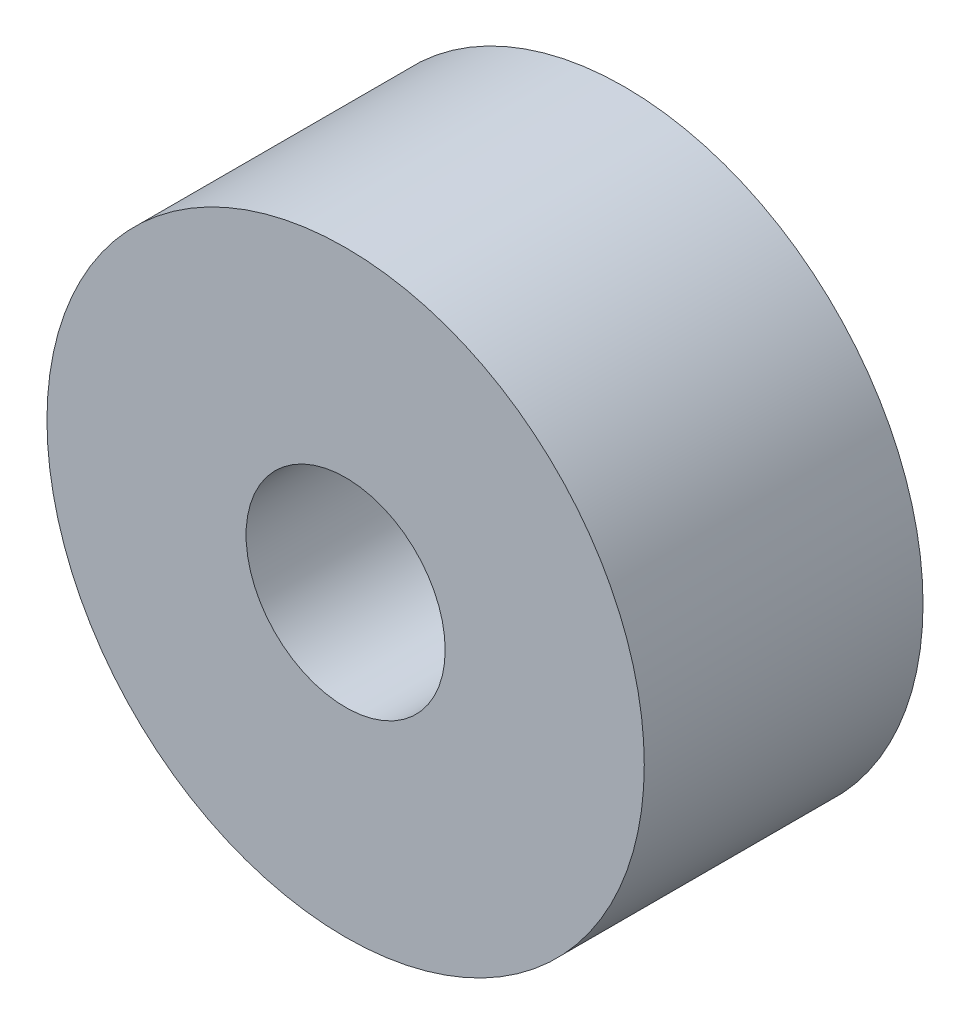
ISO-10303-21;
HEADER;
FILE_DESCRIPTION(('STEP AP214'),'2;1');
FILE_NAME('part.step','',(''),(''),'','','');
FILE_SCHEMA(('AUTOMOTIVE_DESIGN { 1 0 10303 214 1 1 1 1 }'));
ENDSEC;
DATA;
#1=APPLICATION_CONTEXT('core data for automotive mechanical design processes');
#2=APPLICATION_PROTOCOL_DEFINITION('international standard','automotive_design',2000,#1);
#3=PRODUCT_CONTEXT('',#1,'mechanical');
#4=PRODUCT('Part','Part','',(#3));
#5=PRODUCT_RELATED_PRODUCT_CATEGORY('part','',(#4));
#6=PRODUCT_DEFINITION_FORMATION('','',#4);
#7=PRODUCT_DEFINITION_CONTEXT('part definition',#1,'design');
#8=PRODUCT_DEFINITION('design','',#6,#7);
#9=PRODUCT_DEFINITION_SHAPE('','',#8);
#10=(LENGTH_UNIT() NAMED_UNIT(*) SI_UNIT(.MILLI.,.METRE.));
#11=(NAMED_UNIT(*) PLANE_ANGLE_UNIT() SI_UNIT($,.RADIAN.));
#12=(NAMED_UNIT(*) SI_UNIT($,.STERADIAN.) SOLID_ANGLE_UNIT());
#13=UNCERTAINTY_MEASURE_WITH_UNIT(LENGTH_MEASURE(1.E-05),#10,'distance_accuracy_value','');
#14=(GEOMETRIC_REPRESENTATION_CONTEXT(3) GLOBAL_UNCERTAINTY_ASSIGNED_CONTEXT((#13)) GLOBAL_UNIT_ASSIGNED_CONTEXT((#10,
#11,#12)) REPRESENTATION_CONTEXT('',''));
#15=CARTESIAN_POINT('',(0.,0.,0.));
#16=DIRECTION('',(0.,0.,1.));
#17=DIRECTION('',(1.,0.,0.));
#18=AXIS2_PLACEMENT_3D('',#15,#16,#17);
#19=CARTESIAN_POINT('',(0.,0.,14.));
#20=DIRECTION('',(0.,0.,1.));
#21=DIRECTION('',(1.,0.,0.));
#22=AXIS2_PLACEMENT_3D('',#19,#20,#21);
#23=PLANE('',#22);
#24=CARTESIAN_POINT('',(0.,0.,14.));
#25=DIRECTION('',(0.,0.,1.));
#26=DIRECTION('',(1.,0.,0.));
#27=AXIS2_PLACEMENT_3D('',#24,#25,#26);
#28=CIRCLE('',#27,15.);
#29=CARTESIAN_POINT('',(15.,0.,14.));
#30=VERTEX_POINT('',#29);
#31=EDGE_CURVE('E10',#30,#30,#28,.T.);
#32=ORIENTED_EDGE('',*,*,#31,.T.);
#33=EDGE_LOOP('',(#32));
#34=FACE_BOUND('',#33,.T.);
#35=CARTESIAN_POINT('',(0.,0.,14.));
#36=DIRECTION('',(0.,0.,1.));
#37=DIRECTION('',(1.,0.,0.));
#38=AXIS2_PLACEMENT_3D('',#35,#36,#37);
#39=CIRCLE('',#38,5.);
#40=CARTESIAN_POINT('',(5.,0.,14.));
#41=VERTEX_POINT('',#40);
#42=EDGE_CURVE('E50',#41,#41,#39,.T.);
#43=ORIENTED_EDGE('',*,*,#42,.F.);
#44=EDGE_LOOP('',(#43));
#45=FACE_BOUND('',#44,.T.);
#46=ADVANCED_FACE('F37',(#34,#45),#23,.T.);
#47=CARTESIAN_POINT('',(0.,0.,0.));
#48=DIRECTION('',(0.,0.,1.));
#49=DIRECTION('',(1.,0.,0.));
#50=AXIS2_PLACEMENT_3D('',#47,#48,#49);
#51=PLANE('',#50);
#52=CARTESIAN_POINT('',(0.,0.,0.));
#53=DIRECTION('',(0.,0.,1.));
#54=DIRECTION('',(1.,0.,0.));
#55=AXIS2_PLACEMENT_3D('',#52,#53,#54);
#56=CIRCLE('',#55,15.);
#57=CARTESIAN_POINT('',(15.,0.,0.));
#58=VERTEX_POINT('',#57);
#59=EDGE_CURVE('E41',#58,#58,#56,.T.);
#60=ORIENTED_EDGE('',*,*,#59,.F.);
#61=EDGE_LOOP('',(#60));
#62=FACE_BOUND('',#61,.T.);
#63=CARTESIAN_POINT('',(0.,0.,0.));
#64=DIRECTION('',(0.,0.,1.));
#65=DIRECTION('',(1.,0.,0.));
#66=AXIS2_PLACEMENT_3D('',#63,#64,#65);
#67=CIRCLE('',#66,5.);
#68=CARTESIAN_POINT('',(5.,0.,0.));
#69=VERTEX_POINT('',#68);
#70=EDGE_CURVE('E52',#69,#69,#67,.T.);
#71=ORIENTED_EDGE('',*,*,#70,.T.);
#72=EDGE_LOOP('',(#71));
#73=FACE_BOUND('',#72,.T.);
#74=ADVANCED_FACE('F64',(#62,#73),#51,.F.);
#75=CARTESIAN_POINT('',(0.,0.,14.));
#76=DIRECTION('',(0.,0.,-1.));
#77=DIRECTION('',(-1.,0.,0.));
#78=AXIS2_PLACEMENT_3D('',#75,#76,#77);
#79=CYLINDRICAL_SURFACE('',#78,15.);
#80=ORIENTED_EDGE('',*,*,#31,.F.);
#81=EDGE_LOOP('',(#80));
#82=FACE_BOUND('',#81,.T.);
#83=ORIENTED_EDGE('',*,*,#59,.T.);
#84=EDGE_LOOP('',(#83));
#85=FACE_BOUND('',#84,.T.);
#86=ADVANCED_FACE('F39',(#82,#85),#79,.T.);
#87=CARTESIAN_POINT('',(0.,0.,14.));
#88=DIRECTION('',(0.,0.,-1.));
#89=DIRECTION('',(-1.,0.,0.));
#90=AXIS2_PLACEMENT_3D('',#87,#88,#89);
#91=CYLINDRICAL_SURFACE('',#90,5.);
#92=ORIENTED_EDGE('',*,*,#42,.T.);
#93=EDGE_LOOP('',(#92));
#94=FACE_BOUND('',#93,.T.);
#95=ORIENTED_EDGE('',*,*,#70,.F.);
#96=EDGE_LOOP('',(#95));
#97=FACE_BOUND('',#96,.T.);
#98=ADVANCED_FACE('F60',(#94,#97),#91,.F.);
#99=CLOSED_SHELL('',(#46,#74,#86,#98));
#100=MANIFOLD_SOLID_BREP('B2',#99);
#101=ADVANCED_BREP_SHAPE_REPRESENTATION('',(#18,#100),#14);
#102=SHAPE_DEFINITION_REPRESENTATION(#9,#101);
ENDSEC;
END-ISO-10303-21;
